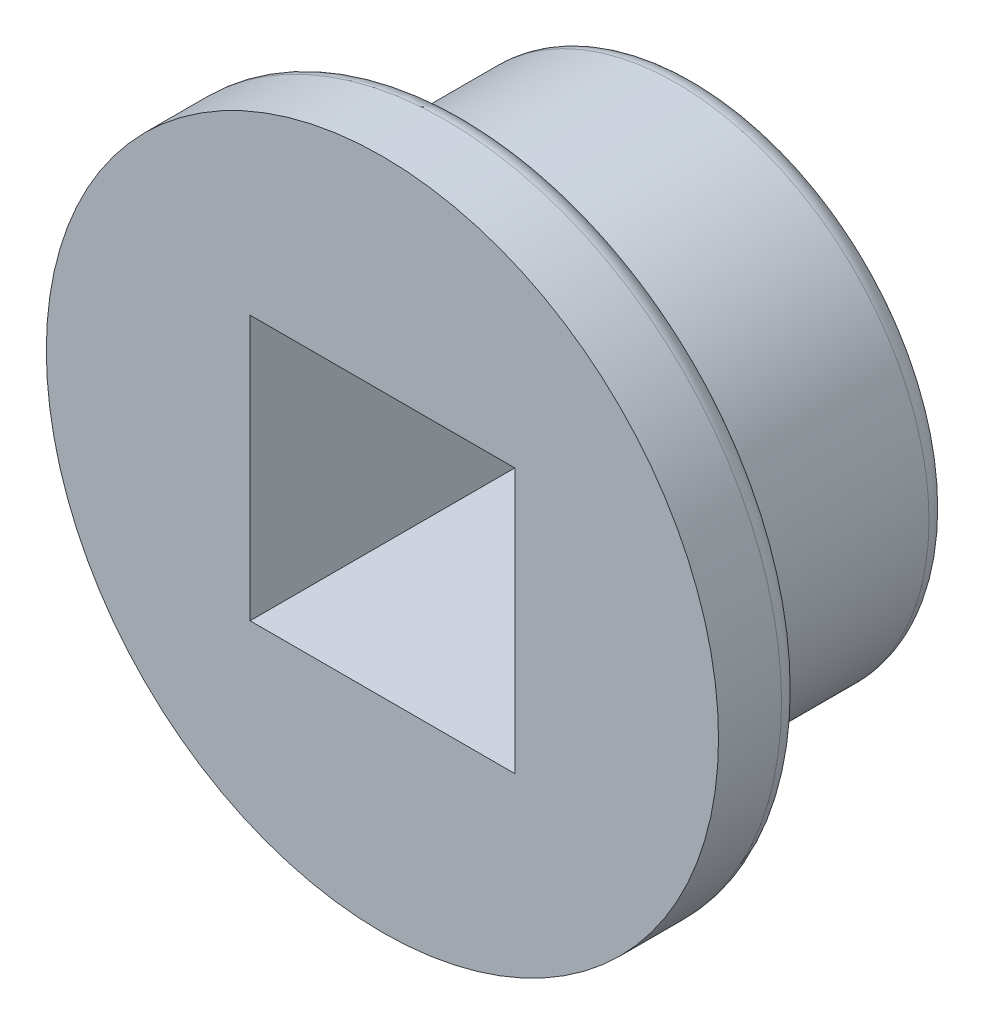
ISO-10303-21;
HEADER;
FILE_DESCRIPTION(('STEP AP214'),'2;1');
FILE_NAME('part.step','',(''),(''),'','','');
FILE_SCHEMA(('AUTOMOTIVE_DESIGN { 1 0 10303 214 1 1 1 1 }'));
ENDSEC;
DATA;
#1=APPLICATION_CONTEXT('core data for automotive mechanical design processes');
#2=APPLICATION_PROTOCOL_DEFINITION('international standard','automotive_design',2000,#1);
#3=PRODUCT_CONTEXT('',#1,'mechanical');
#4=PRODUCT('Part','Part','',(#3));
#5=PRODUCT_RELATED_PRODUCT_CATEGORY('part','',(#4));
#6=PRODUCT_DEFINITION_FORMATION('','',#4);
#7=PRODUCT_DEFINITION_CONTEXT('part definition',#1,'design');
#8=PRODUCT_DEFINITION('design','',#6,#7);
#9=PRODUCT_DEFINITION_SHAPE('','',#8);
#10=(LENGTH_UNIT() NAMED_UNIT(*) SI_UNIT(.MILLI.,.METRE.));
#11=(NAMED_UNIT(*) PLANE_ANGLE_UNIT() SI_UNIT($,.RADIAN.));
#12=(NAMED_UNIT(*) SI_UNIT($,.STERADIAN.) SOLID_ANGLE_UNIT());
#13=UNCERTAINTY_MEASURE_WITH_UNIT(LENGTH_MEASURE(1.E-05),#10,'distance_accuracy_value','');
#14=(GEOMETRIC_REPRESENTATION_CONTEXT(3) GLOBAL_UNCERTAINTY_ASSIGNED_CONTEXT((#13)) GLOBAL_UNIT_ASSIGNED_CONTEXT((#10,
#11,#12)) REPRESENTATION_CONTEXT('',''));
#15=CARTESIAN_POINT('',(0.,0.,0.));
#16=DIRECTION('',(0.,0.,1.));
#17=DIRECTION('',(1.,0.,0.));
#18=AXIS2_PLACEMENT_3D('',#15,#16,#17);
#19=CARTESIAN_POINT('',(0.,3.15,-5.5));
#20=DIRECTION('',(0.,-1.,0.));
#21=DIRECTION('',(0.,0.,-1.));
#22=AXIS2_PLACEMENT_3D('',#19,#20,#21);
#23=PLANE('',#22);
#24=DIRECTION('',(0.,0.,1.));
#25=VECTOR('',#24,1.);
#26=CARTESIAN_POINT('',(3.15,3.15,-5.5));
#27=LINE('',#26,#25);
#28=CARTESIAN_POINT('',(3.15,3.15,-5.5));
#29=VERTEX_POINT('',#28);
#30=CARTESIAN_POINT('',(3.15,3.15,2.));
#31=VERTEX_POINT('',#30);
#32=EDGE_CURVE('E81',#29,#31,#27,.T.);
#33=ORIENTED_EDGE('',*,*,#32,.T.);
#34=DIRECTION('',(1.,0.,0.));
#35=VECTOR('',#34,1.);
#36=CARTESIAN_POINT('',(0.,3.15,2.));
#37=LINE('',#36,#35);
#38=CARTESIAN_POINT('',(-3.15,3.15,2.));
#39=VERTEX_POINT('',#38);
#40=EDGE_CURVE('E84',#39,#31,#37,.T.);
#41=ORIENTED_EDGE('',*,*,#40,.F.);
#42=DIRECTION('',(0.,0.,1.));
#43=VECTOR('',#42,1.);
#44=CARTESIAN_POINT('',(-3.15,3.15,-5.5));
#45=LINE('',#44,#43);
#46=CARTESIAN_POINT('',(-3.15,3.15,-5.5));
#47=VERTEX_POINT('',#46);
#48=EDGE_CURVE('E57',#47,#39,#45,.T.);
#49=ORIENTED_EDGE('',*,*,#48,.F.);
#50=DIRECTION('',(1.,0.,0.));
#51=VECTOR('',#50,1.);
#52=CARTESIAN_POINT('',(0.,3.15,-5.5));
#53=LINE('',#52,#51);
#54=EDGE_CURVE('E86',#47,#29,#53,.T.);
#55=ORIENTED_EDGE('',*,*,#54,.T.);
#56=EDGE_LOOP('',(#33,#41,#49,#55));
#57=FACE_BOUND('',#56,.T.);
#58=ADVANCED_FACE('F41',(#57),#23,.T.);
#59=CARTESIAN_POINT('',(-3.15,0.,-5.5));
#60=DIRECTION('',(-1.,0.,0.));
#61=DIRECTION('',(0.,0.,1.));
#62=AXIS2_PLACEMENT_3D('',#59,#60,#61);
#63=PLANE('',#62);
#64=ORIENTED_EDGE('',*,*,#48,.T.);
#65=DIRECTION('',(0.,-1.,0.));
#66=VECTOR('',#65,1.);
#67=CARTESIAN_POINT('',(-3.15,0.,2.));
#68=LINE('',#67,#66);
#69=CARTESIAN_POINT('',(-3.15,-3.15,2.));
#70=VERTEX_POINT('',#69);
#71=EDGE_CURVE('E105',#39,#70,#68,.T.);
#72=ORIENTED_EDGE('',*,*,#71,.T.);
#73=DIRECTION('',(0.,0.,1.));
#74=VECTOR('',#73,1.);
#75=CARTESIAN_POINT('',(-3.15,-3.15,-5.5));
#76=LINE('',#75,#74);
#77=CARTESIAN_POINT('',(-3.15,-3.15,-5.5));
#78=VERTEX_POINT('',#77);
#79=EDGE_CURVE('E134',#78,#70,#76,.T.);
#80=ORIENTED_EDGE('',*,*,#79,.F.);
#81=DIRECTION('',(0.,-1.,0.));
#82=VECTOR('',#81,1.);
#83=CARTESIAN_POINT('',(-3.15,0.,-5.5));
#84=LINE('',#83,#82);
#85=EDGE_CURVE('E64',#47,#78,#84,.T.);
#86=ORIENTED_EDGE('',*,*,#85,.F.);
#87=EDGE_LOOP('',(#64,#72,#80,#86));
#88=FACE_BOUND('',#87,.T.);
#89=ADVANCED_FACE('F162',(#88),#63,.F.);
#90=CARTESIAN_POINT('',(0.,-3.15,-5.5));
#91=DIRECTION('',(0.,-1.,0.));
#92=DIRECTION('',(0.,0.,-1.));
#93=AXIS2_PLACEMENT_3D('',#90,#91,#92);
#94=PLANE('',#93);
#95=ORIENTED_EDGE('',*,*,#79,.T.);
#96=DIRECTION('',(1.,0.,0.));
#97=VECTOR('',#96,1.);
#98=CARTESIAN_POINT('',(0.,-3.15,2.));
#99=LINE('',#98,#97);
#100=CARTESIAN_POINT('',(3.15,-3.15,2.));
#101=VERTEX_POINT('',#100);
#102=EDGE_CURVE('E101',#70,#101,#99,.T.);
#103=ORIENTED_EDGE('',*,*,#102,.T.);
#104=DIRECTION('',(0.,0.,1.));
#105=VECTOR('',#104,1.);
#106=CARTESIAN_POINT('',(3.15,-3.15,-5.5));
#107=LINE('',#106,#105);
#108=CARTESIAN_POINT('',(3.15,-3.15,-5.5));
#109=VERTEX_POINT('',#108);
#110=EDGE_CURVE('E91',#109,#101,#107,.T.);
#111=ORIENTED_EDGE('',*,*,#110,.F.);
#112=DIRECTION('',(1.,0.,0.));
#113=VECTOR('',#112,1.);
#114=CARTESIAN_POINT('',(0.,-3.15,-5.5));
#115=LINE('',#114,#113);
#116=EDGE_CURVE('E123',#78,#109,#115,.T.);
#117=ORIENTED_EDGE('',*,*,#116,.F.);
#118=EDGE_LOOP('',(#95,#103,#111,#117));
#119=FACE_BOUND('',#118,.T.);
#120=ADVANCED_FACE('F167',(#119),#94,.F.);
#121=CARTESIAN_POINT('',(3.15,0.,-5.5));
#122=DIRECTION('',(-1.,0.,0.));
#123=DIRECTION('',(0.,0.,1.));
#124=AXIS2_PLACEMENT_3D('',#121,#122,#123);
#125=PLANE('',#124);
#126=ORIENTED_EDGE('',*,*,#110,.T.);
#127=DIRECTION('',(0.,-1.,0.));
#128=VECTOR('',#127,1.);
#129=CARTESIAN_POINT('',(3.15,0.,2.));
#130=LINE('',#129,#128);
#131=EDGE_CURVE('E94',#31,#101,#130,.T.);
#132=ORIENTED_EDGE('',*,*,#131,.F.);
#133=ORIENTED_EDGE('',*,*,#32,.F.);
#134=DIRECTION('',(0.,-1.,0.));
#135=VECTOR('',#134,1.);
#136=CARTESIAN_POINT('',(3.15,0.,-5.5));
#137=LINE('',#136,#135);
#138=EDGE_CURVE('E120',#29,#109,#137,.T.);
#139=ORIENTED_EDGE('',*,*,#138,.T.);
#140=EDGE_LOOP('',(#126,#132,#133,#139));
#141=FACE_BOUND('',#140,.T.);
#142=ADVANCED_FACE('F95',(#141),#125,.T.);
#143=CARTESIAN_POINT('',(0.,0.,-5.5));
#144=DIRECTION('',(0.,0.,1.));
#145=DIRECTION('',(1.,0.,0.));
#146=AXIS2_PLACEMENT_3D('',#143,#144,#145);
#147=CYLINDRICAL_SURFACE('',#146,6.01);
#148=CARTESIAN_POINT('',(0.,0.,-5.));
#149=DIRECTION('',(0.,0.,1.));
#150=DIRECTION('',(1.,0.,0.));
#151=AXIS2_PLACEMENT_3D('',#148,#149,#150);
#152=CIRCLE('',#151,6.01);
#153=CARTESIAN_POINT('',(6.01,0.,-5.));
#154=VERTEX_POINT('',#153);
#155=EDGE_CURVE('E50',#154,#154,#152,.T.);
#156=ORIENTED_EDGE('',*,*,#155,.T.);
#157=EDGE_LOOP('',(#156));
#158=FACE_BOUND('',#157,.T.);
#159=CARTESIAN_POINT('',(0.,0.,0.));
#160=DIRECTION('',(0.,0.,1.));
#161=DIRECTION('',(1.,0.,0.));
#162=AXIS2_PLACEMENT_3D('',#159,#160,#161);
#163=CIRCLE('',#162,6.01);
#164=CARTESIAN_POINT('',(6.01,0.,0.));
#165=VERTEX_POINT('',#164);
#166=EDGE_CURVE('E117',#165,#165,#163,.T.);
#167=ORIENTED_EDGE('',*,*,#166,.F.);
#168=EDGE_LOOP('',(#167));
#169=FACE_BOUND('',#168,.T.);
#170=ADVANCED_FACE('F149',(#158,#169),#147,.T.);
#171=CARTESIAN_POINT('',(0.,0.,-5.5));
#172=DIRECTION('',(0.,0.,1.));
#173=DIRECTION('',(1.,0.,0.));
#174=AXIS2_PLACEMENT_3D('',#171,#172,#173);
#175=PLANE('',#174);
#176=CARTESIAN_POINT('',(0.,0.,-5.5));
#177=DIRECTION('',(0.,0.,1.));
#178=DIRECTION('',(1.,0.,0.));
#179=AXIS2_PLACEMENT_3D('',#176,#177,#178);
#180=CIRCLE('',#179,5.51);
#181=CARTESIAN_POINT('',(5.51,0.,-5.5));
#182=VERTEX_POINT('',#181);
#183=EDGE_CURVE('E11',#182,#182,#180,.F.);
#184=ORIENTED_EDGE('',*,*,#183,.T.);
#185=EDGE_LOOP('',(#184));
#186=FACE_BOUND('',#185,.T.);
#187=ORIENTED_EDGE('',*,*,#54,.F.);
#188=ORIENTED_EDGE('',*,*,#85,.T.);
#189=ORIENTED_EDGE('',*,*,#116,.T.);
#190=ORIENTED_EDGE('',*,*,#138,.F.);
#191=EDGE_LOOP('',(#187,#188,#189,#190));
#192=FACE_BOUND('',#191,.T.);
#193=ADVANCED_FACE('F178',(#186,#192),#175,.F.);
#194=CARTESIAN_POINT('',(0.,0.,2.));
#195=DIRECTION('',(0.,0.,-1.));
#196=DIRECTION('',(-1.,0.,0.));
#197=AXIS2_PLACEMENT_3D('',#194,#195,#196);
#198=CYLINDRICAL_SURFACE('',#197,8.);
#199=CARTESIAN_POINT('',(0.,0.,0.5));
#200=DIRECTION('',(0.,0.,1.));
#201=DIRECTION('',(1.,0.,0.));
#202=AXIS2_PLACEMENT_3D('',#199,#200,#201);
#203=CIRCLE('',#202,8.);
#204=CARTESIAN_POINT('',(8.,0.,0.5));
#205=VERTEX_POINT('',#204);
#206=EDGE_CURVE('E133',#205,#205,#203,.T.);
#207=ORIENTED_EDGE('',*,*,#206,.T.);
#208=EDGE_LOOP('',(#207));
#209=FACE_BOUND('',#208,.T.);
#210=CARTESIAN_POINT('',(0.,0.,2.));
#211=DIRECTION('',(0.,0.,1.));
#212=DIRECTION('',(1.,0.,0.));
#213=AXIS2_PLACEMENT_3D('',#210,#211,#212);
#214=CIRCLE('',#213,8.);
#215=CARTESIAN_POINT('',(8.,0.,2.));
#216=VERTEX_POINT('',#215);
#217=EDGE_CURVE('E107',#216,#216,#214,.T.);
#218=ORIENTED_EDGE('',*,*,#217,.F.);
#219=EDGE_LOOP('',(#218));
#220=FACE_BOUND('',#219,.T.);
#221=ADVANCED_FACE('F181',(#209,#220),#198,.T.);
#222=CARTESIAN_POINT('',(0.,0.,2.));
#223=DIRECTION('',(0.,0.,1.));
#224=DIRECTION('',(1.,0.,0.));
#225=AXIS2_PLACEMENT_3D('',#222,#223,#224);
#226=PLANE('',#225);
#227=ORIENTED_EDGE('',*,*,#217,.T.);
#228=EDGE_LOOP('',(#227));
#229=FACE_BOUND('',#228,.T.);
#230=ORIENTED_EDGE('',*,*,#40,.T.);
#231=ORIENTED_EDGE('',*,*,#131,.T.);
#232=ORIENTED_EDGE('',*,*,#102,.F.);
#233=ORIENTED_EDGE('',*,*,#71,.F.);
#234=EDGE_LOOP('',(#230,#231,#232,#233));
#235=FACE_BOUND('',#234,.T.);
#236=ADVANCED_FACE('F103',(#229,#235),#226,.T.);
#237=CARTESIAN_POINT('',(0.,0.,0.));
#238=DIRECTION('',(0.,0.,1.));
#239=DIRECTION('',(1.,0.,0.));
#240=AXIS2_PLACEMENT_3D('',#237,#238,#239);
#241=PLANE('',#240);
#242=CARTESIAN_POINT('',(0.,0.,0.));
#243=DIRECTION('',(0.,0.,1.));
#244=DIRECTION('',(1.,0.,0.));
#245=AXIS2_PLACEMENT_3D('',#242,#243,#244);
#246=CIRCLE('',#245,7.5);
#247=CARTESIAN_POINT('',(7.5,0.,0.));
#248=VERTEX_POINT('',#247);
#249=EDGE_CURVE('E142',#248,#248,#246,.F.);
#250=ORIENTED_EDGE('',*,*,#249,.T.);
#251=EDGE_LOOP('',(#250));
#252=FACE_BOUND('',#251,.T.);
#253=ORIENTED_EDGE('',*,*,#166,.T.);
#254=EDGE_LOOP('',(#253));
#255=FACE_BOUND('',#254,.T.);
#256=ADVANCED_FACE('F158',(#252,#255),#241,.F.);
#257=CARTESIAN_POINT('',(0.,0.,0.5));
#258=DIRECTION('',(0.,0.,1.));
#259=DIRECTION('',(1.,0.,0.));
#260=AXIS2_PLACEMENT_3D('',#257,#258,#259);
#261=TOROIDAL_SURFACE('',#260,7.5,0.5);
#262=ORIENTED_EDGE('',*,*,#249,.F.);
#263=EDGE_LOOP('',(#262));
#264=FACE_BOUND('',#263,.T.);
#265=ORIENTED_EDGE('',*,*,#206,.F.);
#266=EDGE_LOOP('',(#265));
#267=FACE_BOUND('',#266,.T.);
#268=ADVANCED_FACE('F153',(#264,#267),#261,.T.);
#269=CARTESIAN_POINT('',(0.,0.,-5.));
#270=DIRECTION('',(0.,0.,1.));
#271=DIRECTION('',(1.,0.,0.));
#272=AXIS2_PLACEMENT_3D('',#269,#270,#271);
#273=TOROIDAL_SURFACE('',#272,5.51,0.5);
#274=ORIENTED_EDGE('',*,*,#183,.F.);
#275=EDGE_LOOP('',(#274));
#276=FACE_BOUND('',#275,.T.);
#277=ORIENTED_EDGE('',*,*,#155,.F.);
#278=EDGE_LOOP('',(#277));
#279=FACE_BOUND('',#278,.T.);
#280=ADVANCED_FACE('F43',(#276,#279),#273,.T.);
#281=CLOSED_SHELL('',(#58,#89,#120,#142,#170,#193,#221,#236,#256,#268,#280));
#282=MANIFOLD_SOLID_BREP('B2',#281);
#283=ADVANCED_BREP_SHAPE_REPRESENTATION('',(#18,#282),#14);
#284=SHAPE_DEFINITION_REPRESENTATION(#9,#283);
ENDSEC;
END-ISO-10303-21;
